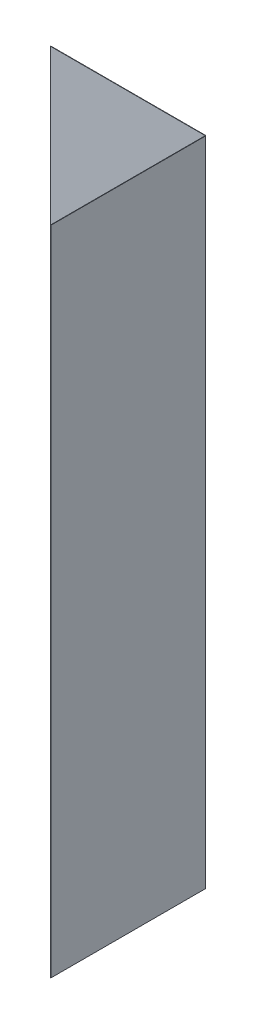
ISO-10303-21;
HEADER;
FILE_DESCRIPTION(('STEP AP214'),'2;1');
FILE_NAME('part.step','',(''),(''),'','','');
FILE_SCHEMA(('AUTOMOTIVE_DESIGN { 1 0 10303 214 1 1 1 1 }'));
ENDSEC;
DATA;
#1=APPLICATION_CONTEXT('core data for automotive mechanical design processes');
#2=APPLICATION_PROTOCOL_DEFINITION('international standard','automotive_design',2000,#1);
#3=PRODUCT_CONTEXT('',#1,'mechanical');
#4=PRODUCT('Part','Part','',(#3));
#5=PRODUCT_RELATED_PRODUCT_CATEGORY('part','',(#4));
#6=PRODUCT_DEFINITION_FORMATION('','',#4);
#7=PRODUCT_DEFINITION_CONTEXT('part definition',#1,'design');
#8=PRODUCT_DEFINITION('design','',#6,#7);
#9=PRODUCT_DEFINITION_SHAPE('','',#8);
#10=(LENGTH_UNIT() NAMED_UNIT(*) SI_UNIT(.MILLI.,.METRE.));
#11=(NAMED_UNIT(*) PLANE_ANGLE_UNIT() SI_UNIT($,.RADIAN.));
#12=(NAMED_UNIT(*) SI_UNIT($,.STERADIAN.) SOLID_ANGLE_UNIT());
#13=UNCERTAINTY_MEASURE_WITH_UNIT(LENGTH_MEASURE(1.E-05),#10,'distance_accuracy_value','');
#14=(GEOMETRIC_REPRESENTATION_CONTEXT(3) GLOBAL_UNCERTAINTY_ASSIGNED_CONTEXT((#13)) GLOBAL_UNIT_ASSIGNED_CONTEXT((#10,
#11,#12)) REPRESENTATION_CONTEXT('',''));
#15=CARTESIAN_POINT('',(0.,0.,0.));
#16=DIRECTION('',(0.,0.,1.));
#17=DIRECTION('',(1.,0.,0.));
#18=AXIS2_PLACEMENT_3D('',#15,#16,#17);
#19=CARTESIAN_POINT('',(-93.7000000000001,-999.5,91.3));
#20=DIRECTION('',(0.,-1.,0.));
#21=DIRECTION('',(0.,0.,-1.));
#22=AXIS2_PLACEMENT_3D('',#19,#20,#21);
#23=PLANE('',#22);
#24=DIRECTION('',(0.,0.,1.));
#25=VECTOR('',#24,1.);
#26=CARTESIAN_POINT('',(-92.5,-999.5,92.5));
#27=LINE('',#26,#25);
#28=CARTESIAN_POINT('',(-92.5,-999.5,93.7));
#29=VERTEX_POINT('',#28);
#30=CARTESIAN_POINT('',(-92.5,-999.5,567.5));
#31=VERTEX_POINT('',#30);
#32=EDGE_CURVE('E79',#29,#31,#27,.T.);
#33=ORIENTED_EDGE('',*,*,#32,.F.);
#34=DIRECTION('',(1.,0.,0.));
#35=VECTOR('',#34,1.);
#36=CARTESIAN_POINT('',(-92.5,-999.5,93.7));
#37=LINE('',#36,#35);
#38=CARTESIAN_POINT('',(-91.3,-999.5,93.7));
#39=VERTEX_POINT('',#38);
#40=EDGE_CURVE('E100',#29,#39,#37,.T.);
#41=ORIENTED_EDGE('',*,*,#40,.T.);
#42=DIRECTION('',(0.,0.,1.));
#43=VECTOR('',#42,1.);
#44=CARTESIAN_POINT('',(-91.3,-999.5,92.5));
#45=LINE('',#44,#43);
#46=CARTESIAN_POINT('',(-91.3,-999.5,567.5));
#47=VERTEX_POINT('',#46);
#48=EDGE_CURVE('E56',#39,#47,#45,.T.);
#49=ORIENTED_EDGE('',*,*,#48,.T.);
#50=DIRECTION('',(-1.,0.,0.));
#51=VECTOR('',#50,1.);
#52=CARTESIAN_POINT('',(-91.3,-999.5,567.5));
#53=LINE('',#52,#51);
#54=EDGE_CURVE('E87',#47,#31,#53,.T.);
#55=ORIENTED_EDGE('',*,*,#54,.T.);
#56=EDGE_LOOP('',(#33,#41,#49,#55));
#57=FACE_BOUND('',#56,.T.);
#58=ADVANCED_FACE('F34',(#57),#23,.T.);
#59=CARTESIAN_POINT('',(-92.5,-999.5,92.5));
#60=DIRECTION('',(-1.,0.,0.));
#61=DIRECTION('',(0.,0.,1.));
#62=AXIS2_PLACEMENT_3D('',#59,#60,#61);
#63=PLANE('',#62);
#64=DIRECTION('',(0.,0.,1.));
#65=VECTOR('',#64,1.);
#66=CARTESIAN_POINT('',(-92.5,999.5,92.5));
#67=LINE('',#66,#65);
#68=CARTESIAN_POINT('',(-92.5,999.5,93.7));
#69=VERTEX_POINT('',#68);
#70=CARTESIAN_POINT('',(-92.5,999.5,567.5));
#71=VERTEX_POINT('',#70);
#72=EDGE_CURVE('E92',#69,#71,#67,.T.);
#73=ORIENTED_EDGE('',*,*,#72,.F.);
#74=DIRECTION('',(0.,1.,0.));
#75=VECTOR('',#74,1.);
#76=CARTESIAN_POINT('',(-92.5,-999.5,93.7));
#77=LINE('',#76,#75);
#78=EDGE_CURVE('E41',#29,#69,#77,.T.);
#79=ORIENTED_EDGE('',*,*,#78,.F.);
#80=ORIENTED_EDGE('',*,*,#32,.T.);
#81=DIRECTION('',(0.,1.,0.));
#82=VECTOR('',#81,1.);
#83=CARTESIAN_POINT('',(-92.5,-999.5,567.5));
#84=LINE('',#83,#82);
#85=EDGE_CURVE('E88',#31,#71,#84,.T.);
#86=ORIENTED_EDGE('',*,*,#85,.T.);
#87=EDGE_LOOP('',(#73,#79,#80,#86));
#88=FACE_BOUND('',#87,.T.);
#89=ADVANCED_FACE('F164',(#88),#63,.T.);
#90=CARTESIAN_POINT('',(-91.3,-999.5,92.5));
#91=DIRECTION('',(-1.,0.,0.));
#92=DIRECTION('',(0.,0.,1.));
#93=AXIS2_PLACEMENT_3D('',#90,#91,#92);
#94=PLANE('',#93);
#95=DIRECTION('',(0.,0.,1.));
#96=VECTOR('',#95,1.);
#97=CARTESIAN_POINT('',(-91.3,999.5,92.5));
#98=LINE('',#97,#96);
#99=CARTESIAN_POINT('',(-91.3,999.5,93.7));
#100=VERTEX_POINT('',#99);
#101=CARTESIAN_POINT('',(-91.3,999.5,567.5));
#102=VERTEX_POINT('',#101);
#103=EDGE_CURVE('E69',#100,#102,#98,.T.);
#104=ORIENTED_EDGE('',*,*,#103,.T.);
#105=DIRECTION('',(0.,1.,0.));
#106=VECTOR('',#105,1.);
#107=CARTESIAN_POINT('',(-91.3,-999.5,567.5));
#108=LINE('',#107,#106);
#109=EDGE_CURVE('E72',#47,#102,#108,.T.);
#110=ORIENTED_EDGE('',*,*,#109,.F.);
#111=ORIENTED_EDGE('',*,*,#48,.F.);
#112=DIRECTION('',(0.,1.,0.));
#113=VECTOR('',#112,1.);
#114=CARTESIAN_POINT('',(-91.3,-999.5,93.7));
#115=LINE('',#114,#113);
#116=EDGE_CURVE('E76',#39,#100,#115,.T.);
#117=ORIENTED_EDGE('',*,*,#116,.T.);
#118=EDGE_LOOP('',(#104,#110,#111,#117));
#119=FACE_BOUND('',#118,.T.);
#120=ADVANCED_FACE('F71',(#119),#94,.F.);
#121=CARTESIAN_POINT('',(-91.3,-999.5,567.5));
#122=DIRECTION('',(0.,0.,-1.));
#123=DIRECTION('',(-1.,0.,0.));
#124=AXIS2_PLACEMENT_3D('',#121,#122,#123);
#125=PLANE('',#124);
#126=DIRECTION('',(-1.,0.,0.));
#127=VECTOR('',#126,1.);
#128=CARTESIAN_POINT('',(-91.3,999.5,567.5));
#129=LINE('',#128,#127);
#130=EDGE_CURVE('E80',#102,#71,#129,.T.);
#131=ORIENTED_EDGE('',*,*,#130,.T.);
#132=ORIENTED_EDGE('',*,*,#85,.F.);
#133=ORIENTED_EDGE('',*,*,#54,.F.);
#134=ORIENTED_EDGE('',*,*,#109,.T.);
#135=EDGE_LOOP('',(#131,#132,#133,#134));
#136=FACE_BOUND('',#135,.T.);
#137=ADVANCED_FACE('F84',(#136),#125,.F.);
#138=CARTESIAN_POINT('',(-93.7000000000001,999.5,93.7));
#139=DIRECTION('',(0.,1.,0.));
#140=DIRECTION('',(1.,0.,0.));
#141=AXIS2_PLACEMENT_3D('',#138,#139,#140);
#142=PLANE('',#141);
#143=ORIENTED_EDGE('',*,*,#72,.T.);
#144=ORIENTED_EDGE('',*,*,#130,.F.);
#145=ORIENTED_EDGE('',*,*,#103,.F.);
#146=DIRECTION('',(-1.,0.,0.));
#147=VECTOR('',#146,1.);
#148=CARTESIAN_POINT('',(-91.3,999.5,93.7));
#149=LINE('',#148,#147);
#150=EDGE_CURVE('E11',#100,#69,#149,.T.);
#151=ORIENTED_EDGE('',*,*,#150,.T.);
#152=EDGE_LOOP('',(#143,#144,#145,#151));
#153=FACE_BOUND('',#152,.T.);
#154=ADVANCED_FACE('F90',(#153),#142,.T.);
#155=CARTESIAN_POINT('',(-567.5,-999.5,92.5));
#156=DIRECTION('',(1.,0.,0.));
#157=DIRECTION('',(0.,0.,-1.));
#158=AXIS2_PLACEMENT_3D('',#155,#156,#157);
#159=PLANE('',#158);
#160=DIRECTION('',(0.,0.,-1.));
#161=VECTOR('',#160,1.);
#162=CARTESIAN_POINT('',(-567.5,999.5,92.5));
#163=LINE('',#162,#161);
#164=CARTESIAN_POINT('',(-567.5,999.5,92.5));
#165=VERTEX_POINT('',#164);
#166=CARTESIAN_POINT('',(-567.5,999.5,91.3));
#167=VERTEX_POINT('',#166);
#168=EDGE_CURVE('E155',#165,#167,#163,.T.);
#169=ORIENTED_EDGE('',*,*,#168,.T.);
#170=DIRECTION('',(0.,1.,0.));
#171=VECTOR('',#170,1.);
#172=CARTESIAN_POINT('',(-567.5,-999.5,91.3));
#173=LINE('',#172,#171);
#174=CARTESIAN_POINT('',(-567.5,-999.5,91.3));
#175=VERTEX_POINT('',#174);
#176=EDGE_CURVE('E146',#175,#167,#173,.T.);
#177=ORIENTED_EDGE('',*,*,#176,.F.);
#178=DIRECTION('',(0.,0.,-1.));
#179=VECTOR('',#178,1.);
#180=CARTESIAN_POINT('',(-567.5,-999.5,92.5));
#181=LINE('',#180,#179);
#182=CARTESIAN_POINT('',(-567.5,-999.5,92.5));
#183=VERTEX_POINT('',#182);
#184=EDGE_CURVE('E137',#183,#175,#181,.T.);
#185=ORIENTED_EDGE('',*,*,#184,.F.);
#186=DIRECTION('',(0.,1.,0.));
#187=VECTOR('',#186,1.);
#188=CARTESIAN_POINT('',(-567.5,-999.5,92.5));
#189=LINE('',#188,#187);
#190=EDGE_CURVE('E152',#183,#165,#189,.T.);
#191=ORIENTED_EDGE('',*,*,#190,.T.);
#192=EDGE_LOOP('',(#169,#177,#185,#191));
#193=FACE_BOUND('',#192,.T.);
#194=ADVANCED_FACE('F202',(#193),#159,.F.);
#195=CARTESIAN_POINT('',(-567.5,-999.5,91.3));
#196=DIRECTION('',(0.,0.,1.));
#197=DIRECTION('',(1.,0.,0.));
#198=AXIS2_PLACEMENT_3D('',#195,#196,#197);
#199=PLANE('',#198);
#200=DIRECTION('',(1.,0.,0.));
#201=VECTOR('',#200,1.);
#202=CARTESIAN_POINT('',(-567.5,999.5,91.3));
#203=LINE('',#202,#201);
#204=CARTESIAN_POINT('',(-93.7,999.5,91.3));
#205=VERTEX_POINT('',#204);
#206=EDGE_CURVE('E149',#167,#205,#203,.T.);
#207=ORIENTED_EDGE('',*,*,#206,.T.);
#208=DIRECTION('',(0.,1.,0.));
#209=VECTOR('',#208,1.);
#210=CARTESIAN_POINT('',(-93.7,-999.5,91.3));
#211=LINE('',#210,#209);
#212=CARTESIAN_POINT('',(-93.7,-999.5,91.3));
#213=VERTEX_POINT('',#212);
#214=EDGE_CURVE('E158',#213,#205,#211,.T.);
#215=ORIENTED_EDGE('',*,*,#214,.F.);
#216=DIRECTION('',(1.,0.,0.));
#217=VECTOR('',#216,1.);
#218=CARTESIAN_POINT('',(-567.5,-999.5,91.3));
#219=LINE('',#218,#217);
#220=EDGE_CURVE('E143',#175,#213,#219,.T.);
#221=ORIENTED_EDGE('',*,*,#220,.F.);
#222=ORIENTED_EDGE('',*,*,#176,.T.);
#223=EDGE_LOOP('',(#207,#215,#221,#222));
#224=FACE_BOUND('',#223,.T.);
#225=ADVANCED_FACE('F186',(#224),#199,.F.);
#226=CARTESIAN_POINT('',(-93.7,-999.5,93.7));
#227=DIRECTION('',(0.,1.,0.));
#228=DIRECTION('',(1.,0.,0.));
#229=AXIS2_PLACEMENT_3D('',#226,#227,#228);
#230=PLANE('',#229);
#231=ORIENTED_EDGE('',*,*,#220,.T.);
#232=DIRECTION('',(0.,0.,1.));
#233=VECTOR('',#232,1.);
#234=CARTESIAN_POINT('',(-93.7,-999.5,91.3));
#235=LINE('',#234,#233);
#236=CARTESIAN_POINT('',(-93.7,-999.5,92.5));
#237=VERTEX_POINT('',#236);
#238=EDGE_CURVE('E140',#213,#237,#235,.T.);
#239=ORIENTED_EDGE('',*,*,#238,.T.);
#240=DIRECTION('',(1.,0.,0.));
#241=VECTOR('',#240,1.);
#242=CARTESIAN_POINT('',(-567.5,-999.5,92.5));
#243=LINE('',#242,#241);
#244=EDGE_CURVE('E135',#183,#237,#243,.T.);
#245=ORIENTED_EDGE('',*,*,#244,.F.);
#246=ORIENTED_EDGE('',*,*,#184,.T.);
#247=EDGE_LOOP('',(#231,#239,#245,#246));
#248=FACE_BOUND('',#247,.T.);
#249=ADVANCED_FACE('F180',(#248),#230,.F.);
#250=CARTESIAN_POINT('',(-567.5,-999.5,92.5));
#251=DIRECTION('',(0.,0.,1.));
#252=DIRECTION('',(1.,0.,0.));
#253=AXIS2_PLACEMENT_3D('',#250,#251,#252);
#254=PLANE('',#253);
#255=DIRECTION('',(1.,0.,0.));
#256=VECTOR('',#255,1.);
#257=CARTESIAN_POINT('',(-567.5,999.5,92.5));
#258=LINE('',#257,#256);
#259=CARTESIAN_POINT('',(-93.7,999.5,92.5));
#260=VERTEX_POINT('',#259);
#261=EDGE_CURVE('E131',#165,#260,#258,.T.);
#262=ORIENTED_EDGE('',*,*,#261,.F.);
#263=ORIENTED_EDGE('',*,*,#190,.F.);
#264=ORIENTED_EDGE('',*,*,#244,.T.);
#265=DIRECTION('',(0.,1.,0.));
#266=VECTOR('',#265,1.);
#267=CARTESIAN_POINT('',(-93.7,-999.5,92.5));
#268=LINE('',#267,#266);
#269=EDGE_CURVE('E122',#237,#260,#268,.T.);
#270=ORIENTED_EDGE('',*,*,#269,.T.);
#271=EDGE_LOOP('',(#262,#263,#264,#270));
#272=FACE_BOUND('',#271,.T.);
#273=ADVANCED_FACE('F204',(#272),#254,.T.);
#274=CARTESIAN_POINT('',(-91.3,999.5,93.7));
#275=DIRECTION('',(0.,1.,0.));
#276=DIRECTION('',(0.,0.,1.));
#277=AXIS2_PLACEMENT_3D('',#274,#275,#276);
#278=PLANE('',#277);
#279=ORIENTED_EDGE('',*,*,#261,.T.);
#280=DIRECTION('',(0.,0.,-1.));
#281=VECTOR('',#280,1.);
#282=CARTESIAN_POINT('',(-93.7,999.5,92.5));
#283=LINE('',#282,#281);
#284=EDGE_CURVE('E94',#260,#205,#283,.T.);
#285=ORIENTED_EDGE('',*,*,#284,.T.);
#286=ORIENTED_EDGE('',*,*,#206,.F.);
#287=ORIENTED_EDGE('',*,*,#168,.F.);
#288=EDGE_LOOP('',(#279,#285,#286,#287));
#289=FACE_BOUND('',#288,.T.);
#290=ADVANCED_FACE('F192',(#289),#278,.T.);
#291=CARTESIAN_POINT('',(-93.7,-999.5,93.7));
#292=DIRECTION('',(0.,-1.,0.));
#293=DIRECTION('',(0.,0.,-1.));
#294=AXIS2_PLACEMENT_3D('',#291,#292,#293);
#295=PLANE('',#294);
#296=ORIENTED_EDGE('',*,*,#40,.F.);
#297=CARTESIAN_POINT('',(-93.7,-999.5,93.7));
#298=DIRECTION('',(0.,-1.,0.));
#299=DIRECTION('',(0.,0.,-1.));
#300=AXIS2_PLACEMENT_3D('',#297,#298,#299);
#301=CIRCLE('',#300,1.2);
#302=EDGE_CURVE('E115',#29,#237,#301,.F.);
#303=ORIENTED_EDGE('',*,*,#302,.T.);
#304=ORIENTED_EDGE('',*,*,#238,.F.);
#305=CARTESIAN_POINT('',(-93.7,-999.5,93.7));
#306=DIRECTION('',(0.,1.,0.));
#307=DIRECTION('',(0.,0.,1.));
#308=AXIS2_PLACEMENT_3D('',#305,#306,#307);
#309=CIRCLE('',#308,2.4);
#310=EDGE_CURVE('E118',#39,#213,#309,.T.);
#311=ORIENTED_EDGE('',*,*,#310,.F.);
#312=EDGE_LOOP('',(#296,#303,#304,#311));
#313=FACE_BOUND('',#312,.T.);
#314=ADVANCED_FACE('F112',(#313),#295,.T.);
#315=CARTESIAN_POINT('',(-93.7,999.5,93.7));
#316=DIRECTION('',(0.,1.,0.));
#317=DIRECTION('',(0.,0.,1.));
#318=AXIS2_PLACEMENT_3D('',#315,#316,#317);
#319=PLANE('',#318);
#320=ORIENTED_EDGE('',*,*,#284,.F.);
#321=CARTESIAN_POINT('',(-93.7,999.5,93.7));
#322=DIRECTION('',(0.,-1.,0.));
#323=DIRECTION('',(0.,0.,-1.));
#324=AXIS2_PLACEMENT_3D('',#321,#322,#323);
#325=CIRCLE('',#324,1.2);
#326=EDGE_CURVE('E124',#260,#69,#325,.T.);
#327=ORIENTED_EDGE('',*,*,#326,.T.);
#328=ORIENTED_EDGE('',*,*,#150,.F.);
#329=CARTESIAN_POINT('',(-93.7,999.5,93.7));
#330=DIRECTION('',(0.,-1.,0.));
#331=DIRECTION('',(0.,0.,-1.));
#332=AXIS2_PLACEMENT_3D('',#329,#330,#331);
#333=CIRCLE('',#332,2.4);
#334=EDGE_CURVE('E161',#205,#100,#333,.T.);
#335=ORIENTED_EDGE('',*,*,#334,.F.);
#336=EDGE_LOOP('',(#320,#327,#328,#335));
#337=FACE_BOUND('',#336,.T.);
#338=ADVANCED_FACE('F170',(#337),#319,.T.);
#339=CARTESIAN_POINT('',(-93.7,1999.00180103646,93.7));
#340=DIRECTION('',(0.,-1.,0.));
#341=DIRECTION('',(0.,0.,-1.));
#342=AXIS2_PLACEMENT_3D('',#339,#340,#341);
#343=CYLINDRICAL_SURFACE('',#342,2.4);
#344=ORIENTED_EDGE('',*,*,#334,.T.);
#345=ORIENTED_EDGE('',*,*,#116,.F.);
#346=ORIENTED_EDGE('',*,*,#310,.T.);
#347=ORIENTED_EDGE('',*,*,#214,.T.);
#348=EDGE_LOOP('',(#344,#345,#346,#347));
#349=FACE_BOUND('',#348,.T.);
#350=ADVANCED_FACE('F174',(#349),#343,.T.);
#351=CARTESIAN_POINT('',(-93.7,1999.00180103646,93.7));
#352=DIRECTION('',(0.,-1.,0.));
#353=DIRECTION('',(0.,0.,-1.));
#354=AXIS2_PLACEMENT_3D('',#351,#352,#353);
#355=CYLINDRICAL_SURFACE('',#354,1.2);
#356=ORIENTED_EDGE('',*,*,#326,.F.);
#357=ORIENTED_EDGE('',*,*,#269,.F.);
#358=ORIENTED_EDGE('',*,*,#302,.F.);
#359=ORIENTED_EDGE('',*,*,#78,.T.);
#360=EDGE_LOOP('',(#356,#357,#358,#359));
#361=FACE_BOUND('',#360,.T.);
#362=ADVANCED_FACE('F120',(#361),#355,.F.);
#363=CLOSED_SHELL('',(#58,#89,#120,#137,#154,#194,#225,#249,#273,#290,#314,#338,#350,#362));
#364=MANIFOLD_SOLID_BREP('B2',#363);
#365=ADVANCED_BREP_SHAPE_REPRESENTATION('',(#18,#364),#14);
#366=SHAPE_DEFINITION_REPRESENTATION(#9,#365);
ENDSEC;
END-ISO-10303-21;
